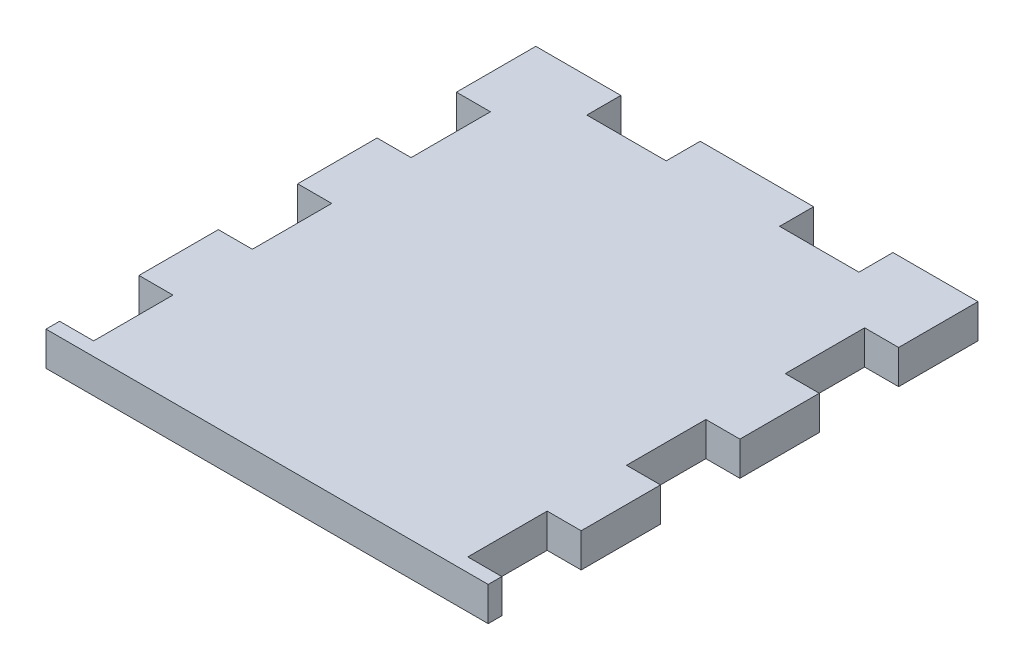
ISO-10303-21;
HEADER;
FILE_DESCRIPTION(('STEP AP214'),'2;1');
FILE_NAME('part.step','',(''),(''),'','','');
FILE_SCHEMA(('AUTOMOTIVE_DESIGN { 1 0 10303 214 1 1 1 1 }'));
ENDSEC;
DATA;
#1=APPLICATION_CONTEXT('core data for automotive mechanical design processes');
#2=APPLICATION_PROTOCOL_DEFINITION('international standard','automotive_design',2000,#1);
#3=PRODUCT_CONTEXT('',#1,'mechanical');
#4=PRODUCT('Part','Part','',(#3));
#5=PRODUCT_RELATED_PRODUCT_CATEGORY('part','',(#4));
#6=PRODUCT_DEFINITION_FORMATION('','',#4);
#7=PRODUCT_DEFINITION_CONTEXT('part definition',#1,'design');
#8=PRODUCT_DEFINITION('design','',#6,#7);
#9=PRODUCT_DEFINITION_SHAPE('','',#8);
#10=(LENGTH_UNIT() NAMED_UNIT(*) SI_UNIT(.MILLI.,.METRE.));
#11=(NAMED_UNIT(*) PLANE_ANGLE_UNIT() SI_UNIT($,.RADIAN.));
#12=(NAMED_UNIT(*) SI_UNIT($,.STERADIAN.) SOLID_ANGLE_UNIT());
#13=UNCERTAINTY_MEASURE_WITH_UNIT(LENGTH_MEASURE(1.E-05),#10,'distance_accuracy_value','');
#14=(GEOMETRIC_REPRESENTATION_CONTEXT(3) GLOBAL_UNCERTAINTY_ASSIGNED_CONTEXT((#13)) GLOBAL_UNIT_ASSIGNED_CONTEXT((#10,
#11,#12)) REPRESENTATION_CONTEXT('',''));
#15=CARTESIAN_POINT('',(0.,0.,0.));
#16=DIRECTION('',(0.,0.,1.));
#17=DIRECTION('',(1.,0.,0.));
#18=AXIS2_PLACEMENT_3D('',#15,#16,#17);
#19=CARTESIAN_POINT('',(0.,3.,-42.));
#20=DIRECTION('',(0.,0.,-1.));
#21=DIRECTION('',(-1.,0.,0.));
#22=AXIS2_PLACEMENT_3D('',#19,#20,#21);
#23=PLANE('',#22);
#24=DIRECTION('',(1.,0.,0.));
#25=VECTOR('',#24,1.);
#26=CARTESIAN_POINT('',(0.,0.,-42.));
#27=LINE('',#26,#25);
#28=CARTESIAN_POINT('',(28.5,0.,-42.));
#29=VERTEX_POINT('',#28);
#30=CARTESIAN_POINT('',(36.,0.,-42.));
#31=VERTEX_POINT('',#30);
#32=EDGE_CURVE('E312',#29,#31,#27,.T.);
#33=ORIENTED_EDGE('',*,*,#32,.F.);
#34=DIRECTION('',(0.,-1.,0.));
#35=VECTOR('',#34,1.);
#36=CARTESIAN_POINT('',(28.5,3.,-42.));
#37=LINE('',#36,#35);
#38=CARTESIAN_POINT('',(28.5,3.,-42.));
#39=VERTEX_POINT('',#38);
#40=EDGE_CURVE('E11',#39,#29,#37,.T.);
#41=ORIENTED_EDGE('',*,*,#40,.F.);
#42=DIRECTION('',(1.,0.,0.));
#43=VECTOR('',#42,1.);
#44=CARTESIAN_POINT('',(0.,3.,-42.));
#45=LINE('',#44,#43);
#46=CARTESIAN_POINT('',(36.,3.,-42.));
#47=VERTEX_POINT('',#46);
#48=EDGE_CURVE('E427',#39,#47,#45,.T.);
#49=ORIENTED_EDGE('',*,*,#48,.T.);
#50=DIRECTION('',(0.,-1.,0.));
#51=VECTOR('',#50,1.);
#52=CARTESIAN_POINT('',(36.,3.,-42.));
#53=LINE('',#52,#51);
#54=EDGE_CURVE('E59',#47,#31,#53,.T.);
#55=ORIENTED_EDGE('',*,*,#54,.T.);
#56=EDGE_LOOP('',(#33,#41,#49,#55));
#57=FACE_BOUND('',#56,.T.);
#58=ADVANCED_FACE('F41',(#57),#23,.T.);
#59=CARTESIAN_POINT('',(28.5,3.,0.));
#60=DIRECTION('',(1.,0.,0.));
#61=DIRECTION('',(0.,0.,-1.));
#62=AXIS2_PLACEMENT_3D('',#59,#60,#61);
#63=PLANE('',#62);
#64=DIRECTION('',(0.,0.,1.));
#65=VECTOR('',#64,1.);
#66=CARTESIAN_POINT('',(28.5,0.,0.));
#67=LINE('',#66,#65);
#68=CARTESIAN_POINT('',(28.5,0.,-39.));
#69=VERTEX_POINT('',#68);
#70=EDGE_CURVE('E315',#29,#69,#67,.T.);
#71=ORIENTED_EDGE('',*,*,#70,.T.);
#72=DIRECTION('',(0.,-1.,0.));
#73=VECTOR('',#72,1.);
#74=CARTESIAN_POINT('',(28.5,3.,-39.));
#75=LINE('',#74,#73);
#76=CARTESIAN_POINT('',(28.5,3.,-39.));
#77=VERTEX_POINT('',#76);
#78=EDGE_CURVE('E51',#77,#69,#75,.T.);
#79=ORIENTED_EDGE('',*,*,#78,.F.);
#80=DIRECTION('',(0.,0.,1.));
#81=VECTOR('',#80,1.);
#82=CARTESIAN_POINT('',(28.5,3.,0.));
#83=LINE('',#82,#81);
#84=EDGE_CURVE('E560',#39,#77,#83,.T.);
#85=ORIENTED_EDGE('',*,*,#84,.F.);
#86=ORIENTED_EDGE('',*,*,#40,.T.);
#87=EDGE_LOOP('',(#71,#79,#85,#86));
#88=FACE_BOUND('',#87,.T.);
#89=ADVANCED_FACE('F43',(#88),#63,.F.);
#90=CARTESIAN_POINT('',(0.,3.,-39.));
#91=DIRECTION('',(0.,0.,1.));
#92=DIRECTION('',(1.,0.,0.));
#93=AXIS2_PLACEMENT_3D('',#90,#91,#92);
#94=PLANE('',#93);
#95=DIRECTION('',(-1.,0.,0.));
#96=VECTOR('',#95,1.);
#97=CARTESIAN_POINT('',(0.,0.,-39.));
#98=LINE('',#97,#96);
#99=CARTESIAN_POINT('',(21.5,0.,-39.));
#100=VERTEX_POINT('',#99);
#101=EDGE_CURVE('E320',#69,#100,#98,.T.);
#102=ORIENTED_EDGE('',*,*,#101,.T.);
#103=DIRECTION('',(0.,-1.,0.));
#104=VECTOR('',#103,1.);
#105=CARTESIAN_POINT('',(21.5,3.,-39.));
#106=LINE('',#105,#104);
#107=CARTESIAN_POINT('',(21.5,3.,-39.));
#108=VERTEX_POINT('',#107);
#109=EDGE_CURVE('E526',#108,#100,#106,.T.);
#110=ORIENTED_EDGE('',*,*,#109,.F.);
#111=DIRECTION('',(-1.,0.,0.));
#112=VECTOR('',#111,1.);
#113=CARTESIAN_POINT('',(0.,3.,-39.));
#114=LINE('',#113,#112);
#115=EDGE_CURVE('E536',#77,#108,#114,.T.);
#116=ORIENTED_EDGE('',*,*,#115,.F.);
#117=ORIENTED_EDGE('',*,*,#78,.T.);
#118=EDGE_LOOP('',(#102,#110,#116,#117));
#119=FACE_BOUND('',#118,.T.);
#120=ADVANCED_FACE('F534',(#119),#94,.F.);
#121=CARTESIAN_POINT('',(21.5,3.,0.));
#122=DIRECTION('',(1.,0.,0.));
#123=DIRECTION('',(0.,0.,-1.));
#124=AXIS2_PLACEMENT_3D('',#121,#122,#123);
#125=PLANE('',#124);
#126=DIRECTION('',(0.,0.,1.));
#127=VECTOR('',#126,1.);
#128=CARTESIAN_POINT('',(21.5,0.,0.));
#129=LINE('',#128,#127);
#130=CARTESIAN_POINT('',(21.5,0.,-42.));
#131=VERTEX_POINT('',#130);
#132=EDGE_CURVE('E324',#131,#100,#129,.T.);
#133=ORIENTED_EDGE('',*,*,#132,.F.);
#134=DIRECTION('',(0.,-1.,0.));
#135=VECTOR('',#134,1.);
#136=CARTESIAN_POINT('',(21.5,3.,-42.));
#137=LINE('',#136,#135);
#138=CARTESIAN_POINT('',(21.5,3.,-42.));
#139=VERTEX_POINT('',#138);
#140=EDGE_CURVE('E523',#139,#131,#137,.T.);
#141=ORIENTED_EDGE('',*,*,#140,.F.);
#142=DIRECTION('',(0.,0.,1.));
#143=VECTOR('',#142,1.);
#144=CARTESIAN_POINT('',(21.5,3.,0.));
#145=LINE('',#144,#143);
#146=EDGE_CURVE('E549',#139,#108,#145,.T.);
#147=ORIENTED_EDGE('',*,*,#146,.T.);
#148=ORIENTED_EDGE('',*,*,#109,.T.);
#149=EDGE_LOOP('',(#133,#141,#147,#148));
#150=FACE_BOUND('',#149,.T.);
#151=ADVANCED_FACE('F546',(#150),#125,.T.);
#152=CARTESIAN_POINT('',(11.5,0.,-42.));
#153=VERTEX_POINT('',#152);
#154=EDGE_CURVE('E317',#153,#131,#27,.T.);
#155=ORIENTED_EDGE('',*,*,#154,.F.);
#156=DIRECTION('',(0.,-1.,0.));
#157=VECTOR('',#156,1.);
#158=CARTESIAN_POINT('',(11.5,3.,-42.));
#159=LINE('',#158,#157);
#160=CARTESIAN_POINT('',(11.5,3.,-42.));
#161=VERTEX_POINT('',#160);
#162=EDGE_CURVE('E520',#161,#153,#159,.T.);
#163=ORIENTED_EDGE('',*,*,#162,.F.);
#164=EDGE_CURVE('E553',#161,#139,#45,.T.);
#165=ORIENTED_EDGE('',*,*,#164,.T.);
#166=ORIENTED_EDGE('',*,*,#140,.T.);
#167=EDGE_LOOP('',(#155,#163,#165,#166));
#168=FACE_BOUND('',#167,.T.);
#169=ADVANCED_FACE('F680',(#168),#23,.T.);
#170=CARTESIAN_POINT('',(11.5,3.,0.));
#171=DIRECTION('',(1.,0.,0.));
#172=DIRECTION('',(0.,0.,-1.));
#173=AXIS2_PLACEMENT_3D('',#170,#171,#172);
#174=PLANE('',#173);
#175=DIRECTION('',(0.,0.,1.));
#176=VECTOR('',#175,1.);
#177=CARTESIAN_POINT('',(11.5,0.,0.));
#178=LINE('',#177,#176);
#179=CARTESIAN_POINT('',(11.5,0.,-39.));
#180=VERTEX_POINT('',#179);
#181=EDGE_CURVE('E328',#153,#180,#178,.T.);
#182=ORIENTED_EDGE('',*,*,#181,.T.);
#183=DIRECTION('',(0.,-1.,0.));
#184=VECTOR('',#183,1.);
#185=CARTESIAN_POINT('',(11.5,3.,-39.));
#186=LINE('',#185,#184);
#187=CARTESIAN_POINT('',(11.5,3.,-39.));
#188=VERTEX_POINT('',#187);
#189=EDGE_CURVE('E517',#188,#180,#186,.T.);
#190=ORIENTED_EDGE('',*,*,#189,.F.);
#191=DIRECTION('',(0.,0.,1.));
#192=VECTOR('',#191,1.);
#193=CARTESIAN_POINT('',(11.5,3.,0.));
#194=LINE('',#193,#192);
#195=EDGE_CURVE('E557',#161,#188,#194,.T.);
#196=ORIENTED_EDGE('',*,*,#195,.F.);
#197=ORIENTED_EDGE('',*,*,#162,.T.);
#198=EDGE_LOOP('',(#182,#190,#196,#197));
#199=FACE_BOUND('',#198,.T.);
#200=ADVANCED_FACE('F687',(#199),#174,.F.);
#201=CARTESIAN_POINT('',(0.,3.,-39.));
#202=DIRECTION('',(0.,0.,-1.));
#203=DIRECTION('',(-1.,0.,0.));
#204=AXIS2_PLACEMENT_3D('',#201,#202,#203);
#205=PLANE('',#204);
#206=DIRECTION('',(1.,0.,0.));
#207=VECTOR('',#206,1.);
#208=CARTESIAN_POINT('',(0.,0.,-39.));
#209=LINE('',#208,#207);
#210=CARTESIAN_POINT('',(4.5,0.,-39.));
#211=VERTEX_POINT('',#210);
#212=EDGE_CURVE('E332',#211,#180,#209,.T.);
#213=ORIENTED_EDGE('',*,*,#212,.F.);
#214=DIRECTION('',(0.,-1.,0.));
#215=VECTOR('',#214,1.);
#216=CARTESIAN_POINT('',(4.5,3.,-39.));
#217=LINE('',#216,#215);
#218=CARTESIAN_POINT('',(4.5,3.,-39.));
#219=VERTEX_POINT('',#218);
#220=EDGE_CURVE('E514',#219,#211,#217,.T.);
#221=ORIENTED_EDGE('',*,*,#220,.F.);
#222=DIRECTION('',(1.,0.,0.));
#223=VECTOR('',#222,1.);
#224=CARTESIAN_POINT('',(0.,3.,-39.));
#225=LINE('',#224,#223);
#226=EDGE_CURVE('E566',#219,#188,#225,.T.);
#227=ORIENTED_EDGE('',*,*,#226,.T.);
#228=ORIENTED_EDGE('',*,*,#189,.T.);
#229=EDGE_LOOP('',(#213,#221,#227,#228));
#230=FACE_BOUND('',#229,.T.);
#231=ADVANCED_FACE('F698',(#230),#205,.T.);
#232=CARTESIAN_POINT('',(4.5,3.,0.));
#233=DIRECTION('',(1.,0.,0.));
#234=DIRECTION('',(0.,0.,-1.));
#235=AXIS2_PLACEMENT_3D('',#232,#233,#234);
#236=PLANE('',#235);
#237=DIRECTION('',(0.,0.,1.));
#238=VECTOR('',#237,1.);
#239=CARTESIAN_POINT('',(4.5,0.,0.));
#240=LINE('',#239,#238);
#241=CARTESIAN_POINT('',(4.5,0.,-42.));
#242=VERTEX_POINT('',#241);
#243=EDGE_CURVE('E336',#242,#211,#240,.T.);
#244=ORIENTED_EDGE('',*,*,#243,.F.);
#245=DIRECTION('',(0.,-1.,0.));
#246=VECTOR('',#245,1.);
#247=CARTESIAN_POINT('',(4.5,3.,-42.));
#248=LINE('',#247,#246);
#249=CARTESIAN_POINT('',(4.5,3.,-42.));
#250=VERTEX_POINT('',#249);
#251=EDGE_CURVE('E511',#250,#242,#248,.T.);
#252=ORIENTED_EDGE('',*,*,#251,.F.);
#253=DIRECTION('',(0.,0.,1.));
#254=VECTOR('',#253,1.);
#255=CARTESIAN_POINT('',(4.5,3.,0.));
#256=LINE('',#255,#254);
#257=EDGE_CURVE('E570',#250,#219,#256,.T.);
#258=ORIENTED_EDGE('',*,*,#257,.T.);
#259=ORIENTED_EDGE('',*,*,#220,.T.);
#260=EDGE_LOOP('',(#244,#252,#258,#259));
#261=FACE_BOUND('',#260,.T.);
#262=ADVANCED_FACE('F691',(#261),#236,.T.);
#263=CARTESIAN_POINT('',(-3.,0.,-42.));
#264=VERTEX_POINT('',#263);
#265=EDGE_CURVE('E316',#264,#242,#27,.T.);
#266=ORIENTED_EDGE('',*,*,#265,.F.);
#267=DIRECTION('',(0.,-1.,0.));
#268=VECTOR('',#267,1.);
#269=CARTESIAN_POINT('',(-3.,3.,-42.));
#270=LINE('',#269,#268);
#271=CARTESIAN_POINT('',(-3.,3.,-42.));
#272=VERTEX_POINT('',#271);
#273=EDGE_CURVE('E508',#272,#264,#270,.T.);
#274=ORIENTED_EDGE('',*,*,#273,.F.);
#275=EDGE_CURVE('E559',#272,#250,#45,.T.);
#276=ORIENTED_EDGE('',*,*,#275,.T.);
#277=ORIENTED_EDGE('',*,*,#251,.T.);
#278=EDGE_LOOP('',(#266,#274,#276,#277));
#279=FACE_BOUND('',#278,.T.);
#280=ADVANCED_FACE('F681',(#279),#23,.T.);
#281=CARTESIAN_POINT('',(-2.99999999999999,3.,0.));
#282=DIRECTION('',(1.,0.,0.));
#283=DIRECTION('',(0.,0.,-1.));
#284=AXIS2_PLACEMENT_3D('',#281,#282,#283);
#285=PLANE('',#284);
#286=DIRECTION('',(0.,0.,1.));
#287=VECTOR('',#286,1.);
#288=CARTESIAN_POINT('',(-2.99999999999999,0.,0.));
#289=LINE('',#288,#287);
#290=CARTESIAN_POINT('',(-3.,0.,-35.));
#291=VERTEX_POINT('',#290);
#292=EDGE_CURVE('E340',#264,#291,#289,.T.);
#293=ORIENTED_EDGE('',*,*,#292,.T.);
#294=DIRECTION('',(0.,-1.,0.));
#295=VECTOR('',#294,1.);
#296=CARTESIAN_POINT('',(-3.,3.,-35.));
#297=LINE('',#296,#295);
#298=CARTESIAN_POINT('',(-3.,3.,-35.));
#299=VERTEX_POINT('',#298);
#300=EDGE_CURVE('E505',#299,#291,#297,.T.);
#301=ORIENTED_EDGE('',*,*,#300,.F.);
#302=DIRECTION('',(0.,0.,1.));
#303=VECTOR('',#302,1.);
#304=CARTESIAN_POINT('',(-2.99999999999999,3.,0.));
#305=LINE('',#304,#303);
#306=EDGE_CURVE('E574',#272,#299,#305,.T.);
#307=ORIENTED_EDGE('',*,*,#306,.F.);
#308=ORIENTED_EDGE('',*,*,#273,.T.);
#309=EDGE_LOOP('',(#293,#301,#307,#308));
#310=FACE_BOUND('',#309,.T.);
#311=ADVANCED_FACE('F690',(#310),#285,.F.);
#312=CARTESIAN_POINT('',(0.,3.,-35.));
#313=DIRECTION('',(0.,0.,1.));
#314=DIRECTION('',(1.,0.,0.));
#315=AXIS2_PLACEMENT_3D('',#312,#313,#314);
#316=PLANE('',#315);
#317=DIRECTION('',(-1.,0.,0.));
#318=VECTOR('',#317,1.);
#319=CARTESIAN_POINT('',(0.,0.,-35.));
#320=LINE('',#319,#318);
#321=CARTESIAN_POINT('',(0.,0.,-35.));
#322=VERTEX_POINT('',#321);
#323=EDGE_CURVE('E344',#322,#291,#320,.T.);
#324=ORIENTED_EDGE('',*,*,#323,.F.);
#325=DIRECTION('',(0.,-1.,0.));
#326=VECTOR('',#325,1.);
#327=CARTESIAN_POINT('',(0.,3.,-35.));
#328=LINE('',#327,#326);
#329=CARTESIAN_POINT('',(0.,3.,-35.));
#330=VERTEX_POINT('',#329);
#331=EDGE_CURVE('E502',#330,#322,#328,.T.);
#332=ORIENTED_EDGE('',*,*,#331,.F.);
#333=DIRECTION('',(-1.,0.,0.));
#334=VECTOR('',#333,1.);
#335=CARTESIAN_POINT('',(0.,3.,-35.));
#336=LINE('',#335,#334);
#337=EDGE_CURVE('E577',#330,#299,#336,.T.);
#338=ORIENTED_EDGE('',*,*,#337,.T.);
#339=ORIENTED_EDGE('',*,*,#300,.T.);
#340=EDGE_LOOP('',(#324,#332,#338,#339));
#341=FACE_BOUND('',#340,.T.);
#342=ADVANCED_FACE('F696',(#341),#316,.T.);
#343=CARTESIAN_POINT('',(0.,3.,0.));
#344=DIRECTION('',(-1.,0.,0.));
#345=DIRECTION('',(0.,0.,1.));
#346=AXIS2_PLACEMENT_3D('',#343,#344,#345);
#347=PLANE('',#346);
#348=DIRECTION('',(0.,0.,-1.));
#349=VECTOR('',#348,1.);
#350=CARTESIAN_POINT('',(0.,0.,0.));
#351=LINE('',#350,#349);
#352=CARTESIAN_POINT('',(0.,0.,-28.));
#353=VERTEX_POINT('',#352);
#354=EDGE_CURVE('E348',#353,#322,#351,.T.);
#355=ORIENTED_EDGE('',*,*,#354,.F.);
#356=DIRECTION('',(0.,-1.,0.));
#357=VECTOR('',#356,1.);
#358=CARTESIAN_POINT('',(0.,3.,-28.));
#359=LINE('',#358,#357);
#360=CARTESIAN_POINT('',(0.,3.,-28.));
#361=VERTEX_POINT('',#360);
#362=EDGE_CURVE('E499',#361,#353,#359,.T.);
#363=ORIENTED_EDGE('',*,*,#362,.F.);
#364=DIRECTION('',(0.,0.,-1.));
#365=VECTOR('',#364,1.);
#366=CARTESIAN_POINT('',(0.,3.,0.));
#367=LINE('',#366,#365);
#368=EDGE_CURVE('E581',#361,#330,#367,.T.);
#369=ORIENTED_EDGE('',*,*,#368,.T.);
#370=ORIENTED_EDGE('',*,*,#331,.T.);
#371=EDGE_LOOP('',(#355,#363,#369,#370));
#372=FACE_BOUND('',#371,.T.);
#373=ADVANCED_FACE('F776',(#372),#347,.T.);
#374=CARTESIAN_POINT('',(0.,3.,-28.));
#375=DIRECTION('',(0.,0.,1.));
#376=DIRECTION('',(1.,0.,0.));
#377=AXIS2_PLACEMENT_3D('',#374,#375,#376);
#378=PLANE('',#377);
#379=DIRECTION('',(-1.,0.,0.));
#380=VECTOR('',#379,1.);
#381=CARTESIAN_POINT('',(0.,0.,-28.));
#382=LINE('',#381,#380);
#383=CARTESIAN_POINT('',(-2.99999999999985,0.,-28.));
#384=VERTEX_POINT('',#383);
#385=EDGE_CURVE('E352',#353,#384,#382,.T.);
#386=ORIENTED_EDGE('',*,*,#385,.T.);
#387=DIRECTION('',(0.,-1.,0.));
#388=VECTOR('',#387,1.);
#389=CARTESIAN_POINT('',(-2.99999999999985,3.,-28.));
#390=LINE('',#389,#388);
#391=CARTESIAN_POINT('',(-2.99999999999985,3.,-28.));
#392=VERTEX_POINT('',#391);
#393=EDGE_CURVE('E495',#392,#384,#390,.T.);
#394=ORIENTED_EDGE('',*,*,#393,.F.);
#395=DIRECTION('',(-1.,0.,0.));
#396=VECTOR('',#395,1.);
#397=CARTESIAN_POINT('',(0.,3.,-28.));
#398=LINE('',#397,#396);
#399=EDGE_CURVE('E585',#361,#392,#398,.T.);
#400=ORIENTED_EDGE('',*,*,#399,.F.);
#401=ORIENTED_EDGE('',*,*,#362,.T.);
#402=EDGE_LOOP('',(#386,#394,#400,#401));
#403=FACE_BOUND('',#402,.T.);
#404=ADVANCED_FACE('F773',(#403),#378,.F.);
#405=CARTESIAN_POINT('',(-2.99999999999985,3.,0.));
#406=DIRECTION('',(1.,0.,0.));
#407=DIRECTION('',(0.,0.,-1.));
#408=AXIS2_PLACEMENT_3D('',#405,#406,#407);
#409=PLANE('',#408);
#410=DIRECTION('',(0.,0.,1.));
#411=VECTOR('',#410,1.);
#412=CARTESIAN_POINT('',(-2.99999999999985,0.,0.));
#413=LINE('',#412,#411);
#414=CARTESIAN_POINT('',(-2.99999999999985,0.,-21.));
#415=VERTEX_POINT('',#414);
#416=EDGE_CURVE('E357',#384,#415,#413,.T.);
#417=ORIENTED_EDGE('',*,*,#416,.T.);
#418=DIRECTION('',(0.,-1.,0.));
#419=VECTOR('',#418,1.);
#420=CARTESIAN_POINT('',(-2.99999999999985,3.,-21.));
#421=LINE('',#420,#419);
#422=CARTESIAN_POINT('',(-2.99999999999985,3.,-21.));
#423=VERTEX_POINT('',#422);
#424=EDGE_CURVE('E492',#423,#415,#421,.T.);
#425=ORIENTED_EDGE('',*,*,#424,.F.);
#426=DIRECTION('',(0.,0.,1.));
#427=VECTOR('',#426,1.);
#428=CARTESIAN_POINT('',(-2.99999999999985,3.,0.));
#429=LINE('',#428,#427);
#430=EDGE_CURVE('E590',#392,#423,#429,.T.);
#431=ORIENTED_EDGE('',*,*,#430,.F.);
#432=ORIENTED_EDGE('',*,*,#393,.T.);
#433=EDGE_LOOP('',(#417,#425,#431,#432));
#434=FACE_BOUND('',#433,.T.);
#435=ADVANCED_FACE('F768',(#434),#409,.F.);
#436=CARTESIAN_POINT('',(0.,3.,-21.));
#437=DIRECTION('',(0.,0.,1.));
#438=DIRECTION('',(1.,0.,0.));
#439=AXIS2_PLACEMENT_3D('',#436,#437,#438);
#440=PLANE('',#439);
#441=DIRECTION('',(-1.,0.,0.));
#442=VECTOR('',#441,1.);
#443=CARTESIAN_POINT('',(0.,0.,-21.));
#444=LINE('',#443,#442);
#445=CARTESIAN_POINT('',(0.,0.,-21.));
#446=VERTEX_POINT('',#445);
#447=EDGE_CURVE('E361',#446,#415,#444,.T.);
#448=ORIENTED_EDGE('',*,*,#447,.F.);
#449=DIRECTION('',(0.,-1.,0.));
#450=VECTOR('',#449,1.);
#451=CARTESIAN_POINT('',(0.,3.,-21.));
#452=LINE('',#451,#450);
#453=CARTESIAN_POINT('',(0.,3.,-21.));
#454=VERTEX_POINT('',#453);
#455=EDGE_CURVE('E489',#454,#446,#452,.T.);
#456=ORIENTED_EDGE('',*,*,#455,.F.);
#457=DIRECTION('',(-1.,0.,0.));
#458=VECTOR('',#457,1.);
#459=CARTESIAN_POINT('',(0.,3.,-21.));
#460=LINE('',#459,#458);
#461=EDGE_CURVE('E593',#454,#423,#460,.T.);
#462=ORIENTED_EDGE('',*,*,#461,.T.);
#463=ORIENTED_EDGE('',*,*,#424,.T.);
#464=EDGE_LOOP('',(#448,#456,#462,#463));
#465=FACE_BOUND('',#464,.T.);
#466=ADVANCED_FACE('F762',(#465),#440,.T.);
#467=CARTESIAN_POINT('',(0.,0.,-14.));
#468=VERTEX_POINT('',#467);
#469=EDGE_CURVE('E354',#468,#446,#351,.T.);
#470=ORIENTED_EDGE('',*,*,#469,.F.);
#471=DIRECTION('',(0.,-1.,0.));
#472=VECTOR('',#471,1.);
#473=CARTESIAN_POINT('',(0.,3.,-14.));
#474=LINE('',#473,#472);
#475=CARTESIAN_POINT('',(0.,3.,-14.));
#476=VERTEX_POINT('',#475);
#477=EDGE_CURVE('E486',#476,#468,#474,.T.);
#478=ORIENTED_EDGE('',*,*,#477,.F.);
#479=EDGE_CURVE('E587',#476,#454,#367,.T.);
#480=ORIENTED_EDGE('',*,*,#479,.T.);
#481=ORIENTED_EDGE('',*,*,#455,.T.);
#482=EDGE_LOOP('',(#470,#478,#480,#481));
#483=FACE_BOUND('',#482,.T.);
#484=ADVANCED_FACE('F758',(#483),#347,.T.);
#485=CARTESIAN_POINT('',(0.,3.,-14.));
#486=DIRECTION('',(0.,0.,1.));
#487=DIRECTION('',(1.,0.,0.));
#488=AXIS2_PLACEMENT_3D('',#485,#486,#487);
#489=PLANE('',#488);
#490=DIRECTION('',(-1.,0.,0.));
#491=VECTOR('',#490,1.);
#492=CARTESIAN_POINT('',(0.,0.,-14.));
#493=LINE('',#492,#491);
#494=CARTESIAN_POINT('',(-2.99999999999971,0.,-14.));
#495=VERTEX_POINT('',#494);
#496=EDGE_CURVE('E365',#468,#495,#493,.T.);
#497=ORIENTED_EDGE('',*,*,#496,.T.);
#498=DIRECTION('',(0.,-1.,0.));
#499=VECTOR('',#498,1.);
#500=CARTESIAN_POINT('',(-2.99999999999971,3.,-14.));
#501=LINE('',#500,#499);
#502=CARTESIAN_POINT('',(-2.99999999999971,3.,-14.));
#503=VERTEX_POINT('',#502);
#504=EDGE_CURVE('E482',#503,#495,#501,.T.);
#505=ORIENTED_EDGE('',*,*,#504,.F.);
#506=DIRECTION('',(-1.,0.,0.));
#507=VECTOR('',#506,1.);
#508=CARTESIAN_POINT('',(0.,3.,-14.));
#509=LINE('',#508,#507);
#510=EDGE_CURVE('E597',#476,#503,#509,.T.);
#511=ORIENTED_EDGE('',*,*,#510,.F.);
#512=ORIENTED_EDGE('',*,*,#477,.T.);
#513=EDGE_LOOP('',(#497,#505,#511,#512));
#514=FACE_BOUND('',#513,.T.);
#515=ADVANCED_FACE('F754',(#514),#489,.F.);
#516=CARTESIAN_POINT('',(-2.9999999999997,3.,0.));
#517=DIRECTION('',(1.,0.,0.));
#518=DIRECTION('',(0.,0.,-1.));
#519=AXIS2_PLACEMENT_3D('',#516,#517,#518);
#520=PLANE('',#519);
#521=DIRECTION('',(0.,0.,1.));
#522=VECTOR('',#521,1.);
#523=CARTESIAN_POINT('',(-2.9999999999997,0.,0.));
#524=LINE('',#523,#522);
#525=CARTESIAN_POINT('',(-2.99999999999971,0.,-7.));
#526=VERTEX_POINT('',#525);
#527=EDGE_CURVE('E368',#495,#526,#524,.T.);
#528=ORIENTED_EDGE('',*,*,#527,.T.);
#529=DIRECTION('',(0.,-1.,0.));
#530=VECTOR('',#529,1.);
#531=CARTESIAN_POINT('',(-2.99999999999971,3.,-7.));
#532=LINE('',#531,#530);
#533=CARTESIAN_POINT('',(-2.99999999999971,3.,-7.));
#534=VERTEX_POINT('',#533);
#535=EDGE_CURVE('E479',#534,#526,#532,.T.);
#536=ORIENTED_EDGE('',*,*,#535,.F.);
#537=DIRECTION('',(0.,0.,1.));
#538=VECTOR('',#537,1.);
#539=CARTESIAN_POINT('',(-2.9999999999997,3.,0.));
#540=LINE('',#539,#538);
#541=EDGE_CURVE('E600',#503,#534,#540,.T.);
#542=ORIENTED_EDGE('',*,*,#541,.F.);
#543=ORIENTED_EDGE('',*,*,#504,.T.);
#544=EDGE_LOOP('',(#528,#536,#542,#543));
#545=FACE_BOUND('',#544,.T.);
#546=ADVANCED_FACE('F750',(#545),#520,.F.);
#547=CARTESIAN_POINT('',(0.,3.,-7.));
#548=DIRECTION('',(0.,0.,1.));
#549=DIRECTION('',(1.,0.,0.));
#550=AXIS2_PLACEMENT_3D('',#547,#548,#549);
#551=PLANE('',#550);
#552=DIRECTION('',(-1.,0.,0.));
#553=VECTOR('',#552,1.);
#554=CARTESIAN_POINT('',(0.,0.,-7.));
#555=LINE('',#554,#553);
#556=CARTESIAN_POINT('',(0.,0.,-7.));
#557=VERTEX_POINT('',#556);
#558=EDGE_CURVE('E372',#557,#526,#555,.T.);
#559=ORIENTED_EDGE('',*,*,#558,.F.);
#560=DIRECTION('',(0.,-1.,0.));
#561=VECTOR('',#560,1.);
#562=CARTESIAN_POINT('',(0.,3.,-7.));
#563=LINE('',#562,#561);
#564=CARTESIAN_POINT('',(0.,3.,-7.));
#565=VERTEX_POINT('',#564);
#566=EDGE_CURVE('E476',#565,#557,#563,.T.);
#567=ORIENTED_EDGE('',*,*,#566,.F.);
#568=DIRECTION('',(-1.,0.,0.));
#569=VECTOR('',#568,1.);
#570=CARTESIAN_POINT('',(0.,3.,-7.));
#571=LINE('',#570,#569);
#572=EDGE_CURVE('E603',#565,#534,#571,.T.);
#573=ORIENTED_EDGE('',*,*,#572,.T.);
#574=ORIENTED_EDGE('',*,*,#535,.T.);
#575=EDGE_LOOP('',(#559,#567,#573,#574));
#576=FACE_BOUND('',#575,.T.);
#577=ADVANCED_FACE('F745',(#576),#551,.T.);
#578=CARTESIAN_POINT('',(0.,0.,0.));
#579=VERTEX_POINT('',#578);
#580=EDGE_CURVE('E353',#579,#557,#351,.T.);
#581=ORIENTED_EDGE('',*,*,#580,.F.);
#582=DIRECTION('',(0.,-1.,0.));
#583=VECTOR('',#582,1.);
#584=CARTESIAN_POINT('',(0.,3.,0.));
#585=LINE('',#584,#583);
#586=CARTESIAN_POINT('',(0.,3.,0.));
#587=VERTEX_POINT('',#586);
#588=EDGE_CURVE('E473',#587,#579,#585,.T.);
#589=ORIENTED_EDGE('',*,*,#588,.F.);
#590=EDGE_CURVE('E586',#587,#565,#367,.T.);
#591=ORIENTED_EDGE('',*,*,#590,.T.);
#592=ORIENTED_EDGE('',*,*,#566,.T.);
#593=EDGE_LOOP('',(#581,#589,#591,#592));
#594=FACE_BOUND('',#593,.T.);
#595=ADVANCED_FACE('F740',(#594),#347,.T.);
#596=CARTESIAN_POINT('',(0.,3.,0.));
#597=DIRECTION('',(0.,0.,-1.));
#598=DIRECTION('',(-1.,0.,0.));
#599=AXIS2_PLACEMENT_3D('',#596,#597,#598);
#600=PLANE('',#599);
#601=DIRECTION('',(1.,0.,0.));
#602=VECTOR('',#601,1.);
#603=CARTESIAN_POINT('',(0.,0.,0.));
#604=LINE('',#603,#602);
#605=CARTESIAN_POINT('',(-2.99999999999971,0.,0.));
#606=VERTEX_POINT('',#605);
#607=EDGE_CURVE('E376',#606,#579,#604,.T.);
#608=ORIENTED_EDGE('',*,*,#607,.F.);
#609=DIRECTION('',(0.,-1.,0.));
#610=VECTOR('',#609,1.);
#611=CARTESIAN_POINT('',(-2.99999999999971,3.,0.));
#612=LINE('',#611,#610);
#613=CARTESIAN_POINT('',(-2.99999999999971,3.,0.));
#614=VERTEX_POINT('',#613);
#615=EDGE_CURVE('E470',#614,#606,#612,.T.);
#616=ORIENTED_EDGE('',*,*,#615,.F.);
#617=DIRECTION('',(1.,0.,0.));
#618=VECTOR('',#617,1.);
#619=CARTESIAN_POINT('',(0.,3.,0.));
#620=LINE('',#619,#618);
#621=EDGE_CURVE('E607',#614,#587,#620,.T.);
#622=ORIENTED_EDGE('',*,*,#621,.T.);
#623=ORIENTED_EDGE('',*,*,#588,.T.);
#624=EDGE_LOOP('',(#608,#616,#622,#623));
#625=FACE_BOUND('',#624,.T.);
#626=ADVANCED_FACE('F734',(#625),#600,.T.);
#627=CARTESIAN_POINT('',(-2.99999999999971,3.,0.));
#628=DIRECTION('',(1.,0.,0.));
#629=DIRECTION('',(0.,0.,-1.));
#630=AXIS2_PLACEMENT_3D('',#627,#628,#629);
#631=PLANE('',#630);
#632=DIRECTION('',(0.,0.,1.));
#633=VECTOR('',#632,1.);
#634=CARTESIAN_POINT('',(-2.99999999999971,0.,0.));
#635=LINE('',#634,#633);
#636=CARTESIAN_POINT('',(-2.99999999999971,0.,1.2));
#637=VERTEX_POINT('',#636);
#638=EDGE_CURVE('E380',#606,#637,#635,.T.);
#639=ORIENTED_EDGE('',*,*,#638,.T.);
#640=DIRECTION('',(0.,-1.,0.));
#641=VECTOR('',#640,1.);
#642=CARTESIAN_POINT('',(-2.99999999999971,3.,1.2));
#643=LINE('',#642,#641);
#644=CARTESIAN_POINT('',(-2.99999999999971,3.,1.2));
#645=VERTEX_POINT('',#644);
#646=EDGE_CURVE('E466',#645,#637,#643,.T.);
#647=ORIENTED_EDGE('',*,*,#646,.F.);
#648=DIRECTION('',(0.,0.,1.));
#649=VECTOR('',#648,1.);
#650=CARTESIAN_POINT('',(-2.99999999999971,3.,0.));
#651=LINE('',#650,#649);
#652=EDGE_CURVE('E611',#614,#645,#651,.T.);
#653=ORIENTED_EDGE('',*,*,#652,.F.);
#654=ORIENTED_EDGE('',*,*,#615,.T.);
#655=EDGE_LOOP('',(#639,#647,#653,#654));
#656=FACE_BOUND('',#655,.T.);
#657=ADVANCED_FACE('F925',(#656),#631,.F.);
#658=CARTESIAN_POINT('',(0.,3.,1.2));
#659=DIRECTION('',(0.,0.,-1.));
#660=DIRECTION('',(-1.,0.,0.));
#661=AXIS2_PLACEMENT_3D('',#658,#659,#660);
#662=PLANE('',#661);
#663=DIRECTION('',(1.,0.,0.));
#664=VECTOR('',#663,1.);
#665=CARTESIAN_POINT('',(0.,0.,1.2));
#666=LINE('',#665,#664);
#667=CARTESIAN_POINT('',(36.,0.,1.2));
#668=VERTEX_POINT('',#667);
#669=EDGE_CURVE('E384',#637,#668,#666,.T.);
#670=ORIENTED_EDGE('',*,*,#669,.T.);
#671=DIRECTION('',(0.,-1.,0.));
#672=VECTOR('',#671,1.);
#673=CARTESIAN_POINT('',(36.,3.,1.2));
#674=LINE('',#673,#672);
#675=CARTESIAN_POINT('',(36.,3.,1.2));
#676=VERTEX_POINT('',#675);
#677=EDGE_CURVE('E463',#676,#668,#674,.T.);
#678=ORIENTED_EDGE('',*,*,#677,.F.);
#679=DIRECTION('',(1.,0.,0.));
#680=VECTOR('',#679,1.);
#681=CARTESIAN_POINT('',(0.,3.,1.2));
#682=LINE('',#681,#680);
#683=EDGE_CURVE('E615',#645,#676,#682,.T.);
#684=ORIENTED_EDGE('',*,*,#683,.F.);
#685=ORIENTED_EDGE('',*,*,#646,.T.);
#686=EDGE_LOOP('',(#670,#678,#684,#685));
#687=FACE_BOUND('',#686,.T.);
#688=ADVANCED_FACE('F728',(#687),#662,.F.);
#689=CARTESIAN_POINT('',(36.,3.,-2.08166817117217E-13));
#690=DIRECTION('',(1.,0.,0.));
#691=DIRECTION('',(0.,0.,-1.));
#692=AXIS2_PLACEMENT_3D('',#689,#690,#691);
#693=PLANE('',#692);
#694=DIRECTION('',(0.,0.,1.));
#695=VECTOR('',#694,1.);
#696=CARTESIAN_POINT('',(36.,0.,-2.08166817117217E-13));
#697=LINE('',#696,#695);
#698=CARTESIAN_POINT('',(36.,0.,0.));
#699=VERTEX_POINT('',#698);
#700=EDGE_CURVE('E388',#699,#668,#697,.T.);
#701=ORIENTED_EDGE('',*,*,#700,.F.);
#702=DIRECTION('',(0.,-1.,0.));
#703=VECTOR('',#702,1.);
#704=CARTESIAN_POINT('',(36.,3.,0.));
#705=LINE('',#704,#703);
#706=CARTESIAN_POINT('',(36.,3.,0.));
#707=VERTEX_POINT('',#706);
#708=EDGE_CURVE('E460',#707,#699,#705,.T.);
#709=ORIENTED_EDGE('',*,*,#708,.F.);
#710=DIRECTION('',(0.,0.,1.));
#711=VECTOR('',#710,1.);
#712=CARTESIAN_POINT('',(36.,3.,-2.08166817117217E-13));
#713=LINE('',#712,#711);
#714=EDGE_CURVE('E618',#707,#676,#713,.T.);
#715=ORIENTED_EDGE('',*,*,#714,.T.);
#716=ORIENTED_EDGE('',*,*,#677,.T.);
#717=EDGE_LOOP('',(#701,#709,#715,#716));
#718=FACE_BOUND('',#717,.T.);
#719=ADVANCED_FACE('F724',(#718),#693,.T.);
#720=CARTESIAN_POINT('',(33.,0.,0.));
#721=VERTEX_POINT('',#720);
#722=EDGE_CURVE('E381',#721,#699,#604,.T.);
#723=ORIENTED_EDGE('',*,*,#722,.F.);
#724=DIRECTION('',(0.,-1.,0.));
#725=VECTOR('',#724,1.);
#726=CARTESIAN_POINT('',(33.,3.,0.));
#727=LINE('',#726,#725);
#728=CARTESIAN_POINT('',(33.,3.,0.));
#729=VERTEX_POINT('',#728);
#730=EDGE_CURVE('E457',#729,#721,#727,.T.);
#731=ORIENTED_EDGE('',*,*,#730,.F.);
#732=EDGE_CURVE('E612',#729,#707,#620,.T.);
#733=ORIENTED_EDGE('',*,*,#732,.T.);
#734=ORIENTED_EDGE('',*,*,#708,.T.);
#735=EDGE_LOOP('',(#723,#731,#733,#734));
#736=FACE_BOUND('',#735,.T.);
#737=ADVANCED_FACE('F719',(#736),#600,.T.);
#738=CARTESIAN_POINT('',(33.,3.,0.));
#739=DIRECTION('',(-1.,0.,0.));
#740=DIRECTION('',(0.,0.,1.));
#741=AXIS2_PLACEMENT_3D('',#738,#739,#740);
#742=PLANE('',#741);
#743=DIRECTION('',(0.,0.,-1.));
#744=VECTOR('',#743,1.);
#745=CARTESIAN_POINT('',(33.,0.,0.));
#746=LINE('',#745,#744);
#747=CARTESIAN_POINT('',(33.,0.,-7.00000000000003));
#748=VERTEX_POINT('',#747);
#749=EDGE_CURVE('E392',#721,#748,#746,.T.);
#750=ORIENTED_EDGE('',*,*,#749,.T.);
#751=DIRECTION('',(0.,-1.,0.));
#752=VECTOR('',#751,1.);
#753=CARTESIAN_POINT('',(33.,3.,-7.00000000000003));
#754=LINE('',#753,#752);
#755=CARTESIAN_POINT('',(33.,3.,-7.00000000000003));
#756=VERTEX_POINT('',#755);
#757=EDGE_CURVE('E453',#756,#748,#754,.T.);
#758=ORIENTED_EDGE('',*,*,#757,.F.);
#759=DIRECTION('',(0.,0.,-1.));
#760=VECTOR('',#759,1.);
#761=CARTESIAN_POINT('',(33.,3.,0.));
#762=LINE('',#761,#760);
#763=EDGE_CURVE('E292',#729,#756,#762,.T.);
#764=ORIENTED_EDGE('',*,*,#763,.F.);
#765=ORIENTED_EDGE('',*,*,#730,.T.);
#766=EDGE_LOOP('',(#750,#758,#764,#765));
#767=FACE_BOUND('',#766,.T.);
#768=ADVANCED_FACE('F959',(#767),#742,.F.);
#769=CARTESIAN_POINT('',(0.,3.,-7.00000000000003));
#770=DIRECTION('',(0.,0.,-1.));
#771=DIRECTION('',(-1.,0.,0.));
#772=AXIS2_PLACEMENT_3D('',#769,#770,#771);
#773=PLANE('',#772);
#774=DIRECTION('',(1.,0.,0.));
#775=VECTOR('',#774,1.);
#776=CARTESIAN_POINT('',(0.,0.,-7.00000000000003));
#777=LINE('',#776,#775);
#778=CARTESIAN_POINT('',(35.9999999999997,0.,-7.00000000000003));
#779=VERTEX_POINT('',#778);
#780=EDGE_CURVE('E395',#748,#779,#777,.T.);
#781=ORIENTED_EDGE('',*,*,#780,.T.);
#782=DIRECTION('',(0.,-1.,0.));
#783=VECTOR('',#782,1.);
#784=CARTESIAN_POINT('',(35.9999999999997,3.,-7.00000000000003));
#785=LINE('',#784,#783);
#786=CARTESIAN_POINT('',(35.9999999999997,3.,-7.00000000000003));
#787=VERTEX_POINT('',#786);
#788=EDGE_CURVE('E450',#787,#779,#785,.T.);
#789=ORIENTED_EDGE('',*,*,#788,.F.);
#790=DIRECTION('',(1.,0.,0.));
#791=VECTOR('',#790,1.);
#792=CARTESIAN_POINT('',(0.,3.,-7.00000000000003));
#793=LINE('',#792,#791);
#794=EDGE_CURVE('E623',#756,#787,#793,.T.);
#795=ORIENTED_EDGE('',*,*,#794,.F.);
#796=ORIENTED_EDGE('',*,*,#757,.T.);
#797=EDGE_LOOP('',(#781,#789,#795,#796));
#798=FACE_BOUND('',#797,.T.);
#799=ADVANCED_FACE('F968',(#798),#773,.F.);
#800=CARTESIAN_POINT('',(35.9999999999997,3.,0.));
#801=DIRECTION('',(1.,0.,0.));
#802=DIRECTION('',(0.,0.,-1.));
#803=AXIS2_PLACEMENT_3D('',#800,#801,#802);
#804=PLANE('',#803);
#805=DIRECTION('',(0.,0.,1.));
#806=VECTOR('',#805,1.);
#807=CARTESIAN_POINT('',(35.9999999999997,0.,0.));
#808=LINE('',#807,#806);
#809=CARTESIAN_POINT('',(35.9999999999997,0.,-14.));
#810=VERTEX_POINT('',#809);
#811=EDGE_CURVE('E400',#810,#779,#808,.T.);
#812=ORIENTED_EDGE('',*,*,#811,.F.);
#813=DIRECTION('',(0.,-1.,0.));
#814=VECTOR('',#813,1.);
#815=CARTESIAN_POINT('',(35.9999999999997,3.,-14.));
#816=LINE('',#815,#814);
#817=CARTESIAN_POINT('',(35.9999999999997,3.,-14.));
#818=VERTEX_POINT('',#817);
#819=EDGE_CURVE('E447',#818,#810,#816,.T.);
#820=ORIENTED_EDGE('',*,*,#819,.F.);
#821=DIRECTION('',(0.,0.,1.));
#822=VECTOR('',#821,1.);
#823=CARTESIAN_POINT('',(35.9999999999997,3.,0.));
#824=LINE('',#823,#822);
#825=EDGE_CURVE('E626',#818,#787,#824,.T.);
#826=ORIENTED_EDGE('',*,*,#825,.T.);
#827=ORIENTED_EDGE('',*,*,#788,.T.);
#828=EDGE_LOOP('',(#812,#820,#826,#827));
#829=FACE_BOUND('',#828,.T.);
#830=ADVANCED_FACE('F979',(#829),#804,.T.);
#831=CARTESIAN_POINT('',(0.,3.,-14.));
#832=DIRECTION('',(0.,0.,-1.));
#833=DIRECTION('',(-1.,0.,0.));
#834=AXIS2_PLACEMENT_3D('',#831,#832,#833);
#835=PLANE('',#834);
#836=DIRECTION('',(1.,0.,0.));
#837=VECTOR('',#836,1.);
#838=CARTESIAN_POINT('',(0.,0.,-14.));
#839=LINE('',#838,#837);
#840=CARTESIAN_POINT('',(33.,0.,-14.));
#841=VERTEX_POINT('',#840);
#842=EDGE_CURVE('E404',#841,#810,#839,.T.);
#843=ORIENTED_EDGE('',*,*,#842,.F.);
#844=DIRECTION('',(0.,-1.,0.));
#845=VECTOR('',#844,1.);
#846=CARTESIAN_POINT('',(33.,3.,-14.));
#847=LINE('',#846,#845);
#848=CARTESIAN_POINT('',(33.,3.,-14.));
#849=VERTEX_POINT('',#848);
#850=EDGE_CURVE('E444',#849,#841,#847,.T.);
#851=ORIENTED_EDGE('',*,*,#850,.F.);
#852=DIRECTION('',(1.,0.,0.));
#853=VECTOR('',#852,1.);
#854=CARTESIAN_POINT('',(0.,3.,-14.));
#855=LINE('',#854,#853);
#856=EDGE_CURVE('E630',#849,#818,#855,.T.);
#857=ORIENTED_EDGE('',*,*,#856,.T.);
#858=ORIENTED_EDGE('',*,*,#819,.T.);
#859=EDGE_LOOP('',(#843,#851,#857,#858));
#860=FACE_BOUND('',#859,.T.);
#861=ADVANCED_FACE('F989',(#860),#835,.T.);
#862=CARTESIAN_POINT('',(33.,0.,-21.));
#863=VERTEX_POINT('',#862);
#864=EDGE_CURVE('E396',#841,#863,#746,.T.);
#865=ORIENTED_EDGE('',*,*,#864,.T.);
#866=DIRECTION('',(0.,-1.,0.));
#867=VECTOR('',#866,1.);
#868=CARTESIAN_POINT('',(33.,3.,-21.));
#869=LINE('',#868,#867);
#870=CARTESIAN_POINT('',(33.,3.,-21.));
#871=VERTEX_POINT('',#870);
#872=EDGE_CURVE('E440',#871,#863,#869,.T.);
#873=ORIENTED_EDGE('',*,*,#872,.F.);
#874=EDGE_CURVE('E291',#849,#871,#762,.T.);
#875=ORIENTED_EDGE('',*,*,#874,.F.);
#876=ORIENTED_EDGE('',*,*,#850,.T.);
#877=EDGE_LOOP('',(#865,#873,#875,#876));
#878=FACE_BOUND('',#877,.T.);
#879=ADVANCED_FACE('F650',(#878),#742,.F.);
#880=CARTESIAN_POINT('',(0.,3.,-21.));
#881=DIRECTION('',(0.,0.,-1.));
#882=DIRECTION('',(-1.,0.,0.));
#883=AXIS2_PLACEMENT_3D('',#880,#881,#882);
#884=PLANE('',#883);
#885=DIRECTION('',(1.,0.,0.));
#886=VECTOR('',#885,1.);
#887=CARTESIAN_POINT('',(0.,0.,-21.));
#888=LINE('',#887,#886);
#889=CARTESIAN_POINT('',(35.9999999999999,0.,-21.));
#890=VERTEX_POINT('',#889);
#891=EDGE_CURVE('E408',#863,#890,#888,.T.);
#892=ORIENTED_EDGE('',*,*,#891,.T.);
#893=DIRECTION('',(0.,-1.,0.));
#894=VECTOR('',#893,1.);
#895=CARTESIAN_POINT('',(35.9999999999999,3.,-21.));
#896=LINE('',#895,#894);
#897=CARTESIAN_POINT('',(35.9999999999999,3.,-21.));
#898=VERTEX_POINT('',#897);
#899=EDGE_CURVE('E437',#898,#890,#896,.T.);
#900=ORIENTED_EDGE('',*,*,#899,.F.);
#901=DIRECTION('',(1.,0.,0.));
#902=VECTOR('',#901,1.);
#903=CARTESIAN_POINT('',(0.,3.,-21.));
#904=LINE('',#903,#902);
#905=EDGE_CURVE('E634',#871,#898,#904,.T.);
#906=ORIENTED_EDGE('',*,*,#905,.F.);
#907=ORIENTED_EDGE('',*,*,#872,.T.);
#908=EDGE_LOOP('',(#892,#900,#906,#907));
#909=FACE_BOUND('',#908,.T.);
#910=ADVANCED_FACE('F656',(#909),#884,.F.);
#911=CARTESIAN_POINT('',(35.9999999999999,3.,0.));
#912=DIRECTION('',(1.,0.,0.));
#913=DIRECTION('',(0.,0.,-1.));
#914=AXIS2_PLACEMENT_3D('',#911,#912,#913);
#915=PLANE('',#914);
#916=DIRECTION('',(0.,0.,1.));
#917=VECTOR('',#916,1.);
#918=CARTESIAN_POINT('',(35.9999999999999,0.,0.));
#919=LINE('',#918,#917);
#920=CARTESIAN_POINT('',(35.9999999999999,0.,-28.));
#921=VERTEX_POINT('',#920);
#922=EDGE_CURVE('E412',#921,#890,#919,.T.);
#923=ORIENTED_EDGE('',*,*,#922,.F.);
#924=DIRECTION('',(0.,-1.,0.));
#925=VECTOR('',#924,1.);
#926=CARTESIAN_POINT('',(35.9999999999999,3.,-28.));
#927=LINE('',#926,#925);
#928=CARTESIAN_POINT('',(35.9999999999999,3.,-28.));
#929=VERTEX_POINT('',#928);
#930=EDGE_CURVE('E434',#929,#921,#927,.T.);
#931=ORIENTED_EDGE('',*,*,#930,.F.);
#932=DIRECTION('',(0.,0.,1.));
#933=VECTOR('',#932,1.);
#934=CARTESIAN_POINT('',(35.9999999999999,3.,0.));
#935=LINE('',#934,#933);
#936=EDGE_CURVE('E636',#929,#898,#935,.T.);
#937=ORIENTED_EDGE('',*,*,#936,.T.);
#938=ORIENTED_EDGE('',*,*,#899,.T.);
#939=EDGE_LOOP('',(#923,#931,#937,#938));
#940=FACE_BOUND('',#939,.T.);
#941=ADVANCED_FACE('F658',(#940),#915,.T.);
#942=CARTESIAN_POINT('',(0.,3.,-28.));
#943=DIRECTION('',(0.,0.,-1.));
#944=DIRECTION('',(-1.,0.,0.));
#945=AXIS2_PLACEMENT_3D('',#942,#943,#944);
#946=PLANE('',#945);
#947=DIRECTION('',(1.,0.,0.));
#948=VECTOR('',#947,1.);
#949=CARTESIAN_POINT('',(0.,0.,-28.));
#950=LINE('',#949,#948);
#951=CARTESIAN_POINT('',(33.,0.,-28.));
#952=VERTEX_POINT('',#951);
#953=EDGE_CURVE('E416',#952,#921,#950,.T.);
#954=ORIENTED_EDGE('',*,*,#953,.F.);
#955=DIRECTION('',(0.,-1.,0.));
#956=VECTOR('',#955,1.);
#957=CARTESIAN_POINT('',(33.,3.,-28.));
#958=LINE('',#957,#956);
#959=CARTESIAN_POINT('',(33.,3.,-28.));
#960=VERTEX_POINT('',#959);
#961=EDGE_CURVE('E301',#960,#952,#958,.T.);
#962=ORIENTED_EDGE('',*,*,#961,.F.);
#963=DIRECTION('',(1.,0.,0.));
#964=VECTOR('',#963,1.);
#965=CARTESIAN_POINT('',(0.,3.,-28.));
#966=LINE('',#965,#964);
#967=EDGE_CURVE('E287',#960,#929,#966,.T.);
#968=ORIENTED_EDGE('',*,*,#967,.T.);
#969=ORIENTED_EDGE('',*,*,#930,.T.);
#970=EDGE_LOOP('',(#954,#962,#968,#969));
#971=FACE_BOUND('',#970,.T.);
#972=ADVANCED_FACE('F643',(#971),#946,.T.);
#973=CARTESIAN_POINT('',(33.,0.,-35.));
#974=VERTEX_POINT('',#973);
#975=EDGE_CURVE('E297',#952,#974,#746,.T.);
#976=ORIENTED_EDGE('',*,*,#975,.T.);
#977=DIRECTION('',(0.,-1.,0.));
#978=VECTOR('',#977,1.);
#979=CARTESIAN_POINT('',(33.,3.,-35.));
#980=LINE('',#979,#978);
#981=CARTESIAN_POINT('',(33.,3.,-35.));
#982=VERTEX_POINT('',#981);
#983=EDGE_CURVE('E294',#982,#974,#980,.T.);
#984=ORIENTED_EDGE('',*,*,#983,.F.);
#985=EDGE_CURVE('E278',#960,#982,#762,.T.);
#986=ORIENTED_EDGE('',*,*,#985,.F.);
#987=ORIENTED_EDGE('',*,*,#961,.T.);
#988=EDGE_LOOP('',(#976,#984,#986,#987));
#989=FACE_BOUND('',#988,.T.);
#990=ADVANCED_FACE('F295',(#989),#742,.F.);
#991=CARTESIAN_POINT('',(0.,3.,-35.));
#992=DIRECTION('',(0.,0.,-1.));
#993=DIRECTION('',(-1.,0.,0.));
#994=AXIS2_PLACEMENT_3D('',#991,#992,#993);
#995=PLANE('',#994);
#996=DIRECTION('',(1.,0.,0.));
#997=VECTOR('',#996,1.);
#998=CARTESIAN_POINT('',(0.,0.,-35.));
#999=LINE('',#998,#997);
#1000=CARTESIAN_POINT('',(36.,0.,-35.));
#1001=VERTEX_POINT('',#1000);
#1002=EDGE_CURVE('E420',#974,#1001,#999,.T.);
#1003=ORIENTED_EDGE('',*,*,#1002,.T.);
#1004=DIRECTION('',(0.,-1.,0.));
#1005=VECTOR('',#1004,1.);
#1006=CARTESIAN_POINT('',(36.,3.,-35.));
#1007=LINE('',#1006,#1005);
#1008=CARTESIAN_POINT('',(36.,3.,-35.));
#1009=VERTEX_POINT('',#1008);
#1010=EDGE_CURVE('E169',#1009,#1001,#1007,.T.);
#1011=ORIENTED_EDGE('',*,*,#1010,.F.);
#1012=DIRECTION('',(1.,0.,0.));
#1013=VECTOR('',#1012,1.);
#1014=CARTESIAN_POINT('',(0.,3.,-35.));
#1015=LINE('',#1014,#1013);
#1016=EDGE_CURVE('E284',#982,#1009,#1015,.T.);
#1017=ORIENTED_EDGE('',*,*,#1016,.F.);
#1018=ORIENTED_EDGE('',*,*,#983,.T.);
#1019=EDGE_LOOP('',(#1003,#1011,#1017,#1018));
#1020=FACE_BOUND('',#1019,.T.);
#1021=ADVANCED_FACE('F303',(#1020),#995,.F.);
#1022=CARTESIAN_POINT('',(36.,3.,0.));
#1023=DIRECTION('',(1.,0.,0.));
#1024=DIRECTION('',(0.,0.,-1.));
#1025=AXIS2_PLACEMENT_3D('',#1022,#1023,#1024);
#1026=PLANE('',#1025);
#1027=DIRECTION('',(0.,0.,1.));
#1028=VECTOR('',#1027,1.);
#1029=CARTESIAN_POINT('',(36.,0.,0.));
#1030=LINE('',#1029,#1028);
#1031=EDGE_CURVE('E423',#31,#1001,#1030,.T.);
#1032=ORIENTED_EDGE('',*,*,#1031,.F.);
#1033=ORIENTED_EDGE('',*,*,#54,.F.);
#1034=DIRECTION('',(0.,0.,1.));
#1035=VECTOR('',#1034,1.);
#1036=CARTESIAN_POINT('',(36.,3.,0.));
#1037=LINE('',#1036,#1035);
#1038=EDGE_CURVE('E305',#47,#1009,#1037,.T.);
#1039=ORIENTED_EDGE('',*,*,#1038,.T.);
#1040=ORIENTED_EDGE('',*,*,#1010,.T.);
#1041=EDGE_LOOP('',(#1032,#1033,#1039,#1040));
#1042=FACE_BOUND('',#1041,.T.);
#1043=ADVANCED_FACE('F1050',(#1042),#1026,.T.);
#1044=CARTESIAN_POINT('',(0.,3.,0.));
#1045=DIRECTION('',(0.,1.,0.));
#1046=DIRECTION('',(0.,0.,1.));
#1047=AXIS2_PLACEMENT_3D('',#1044,#1045,#1046);
#1048=PLANE('',#1047);
#1049=ORIENTED_EDGE('',*,*,#48,.F.);
#1050=ORIENTED_EDGE('',*,*,#84,.T.);
#1051=ORIENTED_EDGE('',*,*,#115,.T.);
#1052=ORIENTED_EDGE('',*,*,#146,.F.);
#1053=ORIENTED_EDGE('',*,*,#164,.F.);
#1054=ORIENTED_EDGE('',*,*,#195,.T.);
#1055=ORIENTED_EDGE('',*,*,#226,.F.);
#1056=ORIENTED_EDGE('',*,*,#257,.F.);
#1057=ORIENTED_EDGE('',*,*,#275,.F.);
#1058=ORIENTED_EDGE('',*,*,#306,.T.);
#1059=ORIENTED_EDGE('',*,*,#337,.F.);
#1060=ORIENTED_EDGE('',*,*,#368,.F.);
#1061=ORIENTED_EDGE('',*,*,#399,.T.);
#1062=ORIENTED_EDGE('',*,*,#430,.T.);
#1063=ORIENTED_EDGE('',*,*,#461,.F.);
#1064=ORIENTED_EDGE('',*,*,#479,.F.);
#1065=ORIENTED_EDGE('',*,*,#510,.T.);
#1066=ORIENTED_EDGE('',*,*,#541,.T.);
#1067=ORIENTED_EDGE('',*,*,#572,.F.);
#1068=ORIENTED_EDGE('',*,*,#590,.F.);
#1069=ORIENTED_EDGE('',*,*,#621,.F.);
#1070=ORIENTED_EDGE('',*,*,#652,.T.);
#1071=ORIENTED_EDGE('',*,*,#683,.T.);
#1072=ORIENTED_EDGE('',*,*,#714,.F.);
#1073=ORIENTED_EDGE('',*,*,#732,.F.);
#1074=ORIENTED_EDGE('',*,*,#763,.T.);
#1075=ORIENTED_EDGE('',*,*,#794,.T.);
#1076=ORIENTED_EDGE('',*,*,#825,.F.);
#1077=ORIENTED_EDGE('',*,*,#856,.F.);
#1078=ORIENTED_EDGE('',*,*,#874,.T.);
#1079=ORIENTED_EDGE('',*,*,#905,.T.);
#1080=ORIENTED_EDGE('',*,*,#936,.F.);
#1081=ORIENTED_EDGE('',*,*,#967,.F.);
#1082=ORIENTED_EDGE('',*,*,#985,.T.);
#1083=ORIENTED_EDGE('',*,*,#1016,.T.);
#1084=ORIENTED_EDGE('',*,*,#1038,.F.);
#1085=EDGE_LOOP('',(#1049,#1050,#1051,#1052,#1053,#1054,#1055,#1056,#1057,#1058,#1059,#1060,
#1061,#1062,#1063,#1064,#1065,#1066,#1067,#1068,#1069,#1070,#1071,#1072,#1073,#1074,#1075,#1076,
#1077,#1078,#1079,#1080,#1081,#1082,#1083,#1084));
#1086=FACE_BOUND('',#1085,.T.);
#1087=ADVANCED_FACE('F281',(#1086),#1048,.T.);
#1088=CARTESIAN_POINT('',(0.,0.,0.));
#1089=DIRECTION('',(0.,1.,0.));
#1090=DIRECTION('',(0.,0.,1.));
#1091=AXIS2_PLACEMENT_3D('',#1088,#1089,#1090);
#1092=PLANE('',#1091);
#1093=ORIENTED_EDGE('',*,*,#32,.T.);
#1094=ORIENTED_EDGE('',*,*,#1031,.T.);
#1095=ORIENTED_EDGE('',*,*,#1002,.F.);
#1096=ORIENTED_EDGE('',*,*,#975,.F.);
#1097=ORIENTED_EDGE('',*,*,#953,.T.);
#1098=ORIENTED_EDGE('',*,*,#922,.T.);
#1099=ORIENTED_EDGE('',*,*,#891,.F.);
#1100=ORIENTED_EDGE('',*,*,#864,.F.);
#1101=ORIENTED_EDGE('',*,*,#842,.T.);
#1102=ORIENTED_EDGE('',*,*,#811,.T.);
#1103=ORIENTED_EDGE('',*,*,#780,.F.);
#1104=ORIENTED_EDGE('',*,*,#749,.F.);
#1105=ORIENTED_EDGE('',*,*,#722,.T.);
#1106=ORIENTED_EDGE('',*,*,#700,.T.);
#1107=ORIENTED_EDGE('',*,*,#669,.F.);
#1108=ORIENTED_EDGE('',*,*,#638,.F.);
#1109=ORIENTED_EDGE('',*,*,#607,.T.);
#1110=ORIENTED_EDGE('',*,*,#580,.T.);
#1111=ORIENTED_EDGE('',*,*,#558,.T.);
#1112=ORIENTED_EDGE('',*,*,#527,.F.);
#1113=ORIENTED_EDGE('',*,*,#496,.F.);
#1114=ORIENTED_EDGE('',*,*,#469,.T.);
#1115=ORIENTED_EDGE('',*,*,#447,.T.);
#1116=ORIENTED_EDGE('',*,*,#416,.F.);
#1117=ORIENTED_EDGE('',*,*,#385,.F.);
#1118=ORIENTED_EDGE('',*,*,#354,.T.);
#1119=ORIENTED_EDGE('',*,*,#323,.T.);
#1120=ORIENTED_EDGE('',*,*,#292,.F.);
#1121=ORIENTED_EDGE('',*,*,#265,.T.);
#1122=ORIENTED_EDGE('',*,*,#243,.T.);
#1123=ORIENTED_EDGE('',*,*,#212,.T.);
#1124=ORIENTED_EDGE('',*,*,#181,.F.);
#1125=ORIENTED_EDGE('',*,*,#154,.T.);
#1126=ORIENTED_EDGE('',*,*,#132,.T.);
#1127=ORIENTED_EDGE('',*,*,#101,.F.);
#1128=ORIENTED_EDGE('',*,*,#70,.F.);
#1129=EDGE_LOOP('',(#1093,#1094,#1095,#1096,#1097,#1098,#1099,#1100,#1101,#1102,#1103,#1104,
#1105,#1106,#1107,#1108,#1109,#1110,#1111,#1112,#1113,#1114,#1115,#1116,#1117,#1118,#1119,#1120,
#1121,#1122,#1123,#1124,#1125,#1126,#1127,#1128));
#1130=FACE_BOUND('',#1129,.T.);
#1131=ADVANCED_FACE('F540',(#1130),#1092,.F.);
#1132=CLOSED_SHELL('',(#58,#89,#120,#151,#169,#200,#231,#262,#280,#311,#342,#373,#404,#435,#466,
#484,#515,#546,#577,#595,#626,#657,#688,#719,#737,#768,#799,#830,#861,#879,#910,#941,#972,#990,
#1021,#1043,#1087,#1131));
#1133=MANIFOLD_SOLID_BREP('B2',#1132);
#1134=ADVANCED_BREP_SHAPE_REPRESENTATION('',(#18,#1133),#14);
#1135=SHAPE_DEFINITION_REPRESENTATION(#9,#1134);
ENDSEC;
END-ISO-10303-21;
